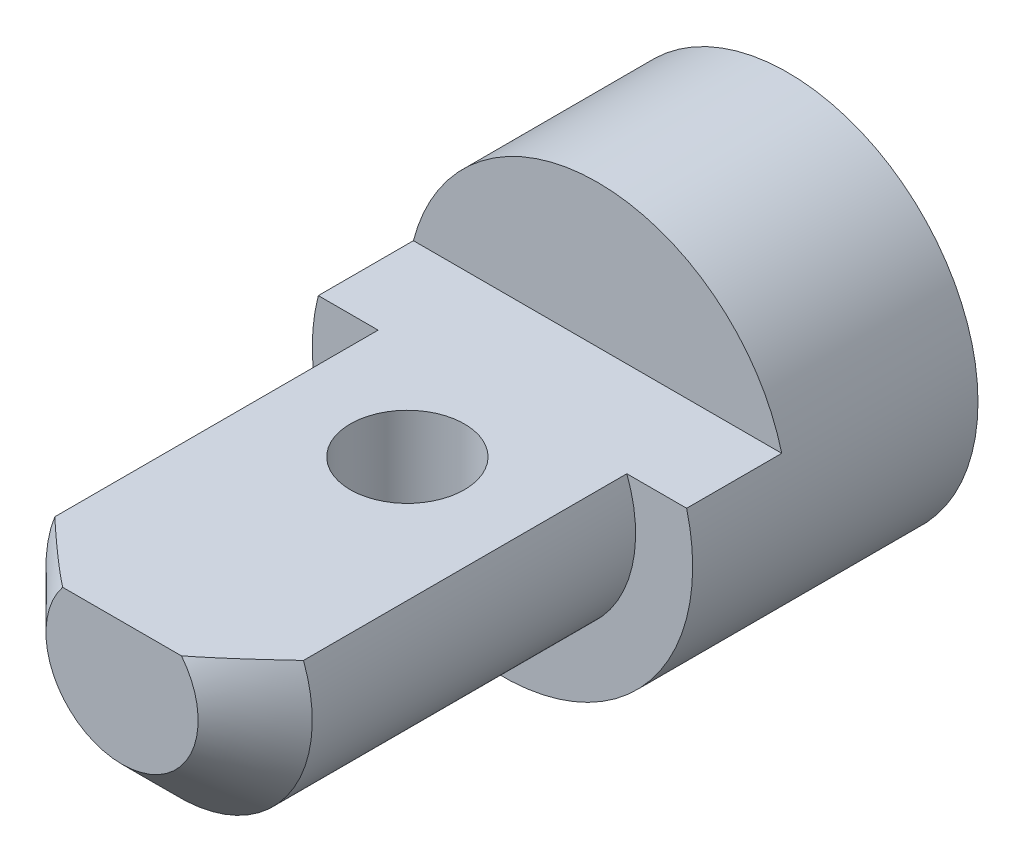
ISO-10303-21;
HEADER;
FILE_DESCRIPTION(('STEP AP214'),'2;1');
FILE_NAME('part.step','',(''),(''),'','','');
FILE_SCHEMA(('AUTOMOTIVE_DESIGN { 1 0 10303 214 1 1 1 1 }'));
ENDSEC;
DATA;
#1=APPLICATION_CONTEXT('core data for automotive mechanical design processes');
#2=APPLICATION_PROTOCOL_DEFINITION('international standard','automotive_design',2000,#1);
#3=PRODUCT_CONTEXT('',#1,'mechanical');
#4=PRODUCT('Part','Part','',(#3));
#5=PRODUCT_RELATED_PRODUCT_CATEGORY('part','',(#4));
#6=PRODUCT_DEFINITION_FORMATION('','',#4);
#7=PRODUCT_DEFINITION_CONTEXT('part definition',#1,'design');
#8=PRODUCT_DEFINITION('design','',#6,#7);
#9=PRODUCT_DEFINITION_SHAPE('','',#8);
#10=(LENGTH_UNIT() NAMED_UNIT(*) SI_UNIT(.MILLI.,.METRE.));
#11=(NAMED_UNIT(*) PLANE_ANGLE_UNIT() SI_UNIT($,.RADIAN.));
#12=(NAMED_UNIT(*) SI_UNIT($,.STERADIAN.) SOLID_ANGLE_UNIT());
#13=UNCERTAINTY_MEASURE_WITH_UNIT(LENGTH_MEASURE(1.E-05),#10,'distance_accuracy_value','');
#14=(GEOMETRIC_REPRESENTATION_CONTEXT(3) GLOBAL_UNCERTAINTY_ASSIGNED_CONTEXT((#13)) GLOBAL_UNIT_ASSIGNED_CONTEXT((#10,
#11,#12)) REPRESENTATION_CONTEXT('',''));
#15=CARTESIAN_POINT('',(0.,0.,0.));
#16=DIRECTION('',(0.,0.,1.));
#17=DIRECTION('',(1.,0.,0.));
#18=AXIS2_PLACEMENT_3D('',#15,#16,#17);
#19=CARTESIAN_POINT('',(0.,0.,0.));
#20=DIRECTION('',(0.,0.,1.));
#21=DIRECTION('',(1.,0.,0.));
#22=AXIS2_PLACEMENT_3D('',#19,#20,#21);
#23=PLANE('',#22);
#24=CARTESIAN_POINT('',(0.,0.,0.));
#25=DIRECTION('',(0.,0.,1.));
#26=DIRECTION('',(1.,0.,0.));
#27=AXIS2_PLACEMENT_3D('',#24,#25,#26);
#28=CIRCLE('',#27,20.);
#29=CARTESIAN_POINT('',(19.3649167310371,5.,0.));
#30=VERTEX_POINT('',#29);
#31=CARTESIAN_POINT('',(-19.3649167310371,5.,0.));
#32=VERTEX_POINT('',#31);
#33=EDGE_CURVE('E116',#30,#32,#28,.T.);
#34=ORIENTED_EDGE('',*,*,#33,.T.);
#35=DIRECTION('',(1.,0.,0.));
#36=VECTOR('',#35,1.);
#37=CARTESIAN_POINT('',(0.,5.,0.));
#38=LINE('',#37,#36);
#39=EDGE_CURVE('E105',#32,#30,#38,.T.);
#40=ORIENTED_EDGE('',*,*,#39,.T.);
#41=EDGE_LOOP('',(#34,#40));
#42=FACE_BOUND('',#41,.T.);
#43=ADVANCED_FACE('F35',(#42),#23,.T.);
#44=CARTESIAN_POINT('',(0.,0.,-20.));
#45=DIRECTION('',(0.,0.,1.));
#46=DIRECTION('',(1.,0.,0.));
#47=AXIS2_PLACEMENT_3D('',#44,#45,#46);
#48=CYLINDRICAL_SURFACE('',#47,20.);
#49=CARTESIAN_POINT('',(0.,0.,-20.));
#50=DIRECTION('',(0.,0.,1.));
#51=DIRECTION('',(1.,0.,0.));
#52=AXIS2_PLACEMENT_3D('',#49,#50,#51);
#53=CIRCLE('',#52,20.);
#54=CARTESIAN_POINT('',(20.,0.,-20.));
#55=VERTEX_POINT('',#54);
#56=EDGE_CURVE('E117',#55,#55,#53,.T.);
#57=ORIENTED_EDGE('',*,*,#56,.T.);
#58=EDGE_LOOP('',(#57));
#59=FACE_BOUND('',#58,.T.);
#60=ORIENTED_EDGE('',*,*,#33,.F.);
#61=DIRECTION('',(0.,0.,-1.));
#62=VECTOR('',#61,1.);
#63=CARTESIAN_POINT('',(19.3649167310371,5.,10.));
#64=LINE('',#63,#62);
#65=CARTESIAN_POINT('',(19.3649167310371,5.,10.));
#66=VERTEX_POINT('',#65);
#67=EDGE_CURVE('E101',#66,#30,#64,.T.);
#68=ORIENTED_EDGE('',*,*,#67,.F.);
#69=CARTESIAN_POINT('',(0.,0.,10.));
#70=DIRECTION('',(0.,0.,1.));
#71=DIRECTION('',(1.,0.,0.));
#72=AXIS2_PLACEMENT_3D('',#69,#70,#71);
#73=CIRCLE('',#72,20.);
#74=CARTESIAN_POINT('',(-19.3649167310371,5.,10.));
#75=VERTEX_POINT('',#74);
#76=EDGE_CURVE('E99',#75,#66,#73,.T.);
#77=ORIENTED_EDGE('',*,*,#76,.F.);
#78=DIRECTION('',(0.,0.,-1.));
#79=VECTOR('',#78,1.);
#80=CARTESIAN_POINT('',(-19.3649167310371,5.,10.));
#81=LINE('',#80,#79);
#82=EDGE_CURVE('E113',#75,#32,#81,.T.);
#83=ORIENTED_EDGE('',*,*,#82,.T.);
#84=EDGE_LOOP('',(#60,#68,#77,#83));
#85=FACE_BOUND('',#84,.T.);
#86=ADVANCED_FACE('F145',(#59,#85),#48,.T.);
#87=CARTESIAN_POINT('',(0.,0.,-20.));
#88=DIRECTION('',(0.,0.,1.));
#89=DIRECTION('',(1.,0.,0.));
#90=AXIS2_PLACEMENT_3D('',#87,#88,#89);
#91=PLANE('',#90);
#92=ORIENTED_EDGE('',*,*,#56,.F.);
#93=EDGE_LOOP('',(#92));
#94=FACE_BOUND('',#93,.T.);
#95=ADVANCED_FACE('F140',(#94),#91,.F.);
#96=CARTESIAN_POINT('',(0.,5.,10.));
#97=DIRECTION('',(0.,1.,0.));
#98=DIRECTION('',(0.,0.,1.));
#99=AXIS2_PLACEMENT_3D('',#96,#97,#98);
#100=PLANE('',#99);
#101=CARTESIAN_POINT('',(0.,5.,20.));
#102=DIRECTION('',(0.,1.,0.));
#103=DIRECTION('',(0.,0.,1.));
#104=AXIS2_PLACEMENT_3D('',#101,#102,#103);
#105=CIRCLE('',#104,6.);
#106=CARTESIAN_POINT('',(0.,5.,26.));
#107=VERTEX_POINT('',#106);
#108=EDGE_CURVE('E164',#107,#107,#105,.T.);
#109=ORIENTED_EDGE('',*,*,#108,.F.);
#110=EDGE_LOOP('',(#109));
#111=FACE_BOUND('',#110,.T.);
#112=DIRECTION('',(1.,0.,0.));
#113=VECTOR('',#112,1.);
#114=CARTESIAN_POINT('',(0.,5.,50.));
#115=LINE('',#114,#113);
#116=CARTESIAN_POINT('',(-6.24499799839841,5.,50.));
#117=VERTEX_POINT('',#116);
#118=CARTESIAN_POINT('',(6.24499799839841,5.,50.));
#119=VERTEX_POINT('',#118);
#120=EDGE_CURVE('E90',#117,#119,#115,.T.);
#121=ORIENTED_EDGE('',*,*,#120,.T.);
#122=CARTESIAN_POINT('',(6.24499799839841,5.,50.));
#123=CARTESIAN_POINT('',(6.39443122448454,5.,49.8833329823802));
#124=CARTESIAN_POINT('',(6.54308298546125,5.,49.7656720286842));
#125=CARTESIAN_POINT('',(6.83900305782603,5.,49.5286335268259));
#126=CARTESIAN_POINT('',(6.98627142153504,5.,49.4092560440194));
#127=CARTESIAN_POINT('',(7.27959406918002,5.,49.1690644102696));
#128=CARTESIAN_POINT('',(7.42564852737438,5.,49.0482504718027));
#129=CARTESIAN_POINT('',(7.71671327943721,5.,48.8053691428922));
#130=CARTESIAN_POINT('',(7.86172356180913,5.,48.6833017386834));
#131=CARTESIAN_POINT('',(8.29526067818571,5.,48.3155872050473));
#132=CARTESIAN_POINT('',(8.58241830801299,5.,48.0683252862952));
#133=CARTESIAN_POINT('',(9.15388909912427,5.,47.5705205120621));
#134=CARTESIAN_POINT('',(9.4382021352831,5.,47.3199775133658));
#135=CARTESIAN_POINT('',(10.0044556376435,5.,46.8164239431659));
#136=CARTESIAN_POINT('',(10.2863968925452,5.,46.5634142576553));
#137=CARTESIAN_POINT('',(10.8484442680545,5.,46.05536441232));
#138=CARTESIAN_POINT('',(11.1285503803207,5.,45.8003242432773));
#139=CARTESIAN_POINT('',(11.6873751197916,5.,45.2885044394326));
#140=CARTESIAN_POINT('',(11.9660931421804,5.,45.0317241448872));
#141=CARTESIAN_POINT('',(12.5222743698344,5.,44.5168081566791));
#142=CARTESIAN_POINT('',(12.799737576059,5.,44.258672464053));
#143=CARTESIAN_POINT('',(13.076696830622,5.,44.));
#144=B_SPLINE_CURVE_WITH_KNOTS('',3,(#122,#123,#124,#125,#126,#127,#128,#129,#130,#131,#132,
#133,#134,#135,#136,#137,#138,#139,#140,#141,#142,#143),.UNSPECIFIED.,.F.,.F.,(4,2,2,2,2,2,2,2,
2,2,4),(0.,0.568736687157001,1.13745177703299,1.70608376559099,2.27472200533744,
3.41151474217863,4.54835726520981,5.68480548564971,6.82125886818381,7.95817035954114,
9.09508098142301),.UNSPECIFIED.);
#145=CARTESIAN_POINT('',(13.076696830622,5.,44.));
#146=VERTEX_POINT('',#145);
#147=EDGE_CURVE('E50',#119,#146,#144,.T.);
#148=ORIENTED_EDGE('',*,*,#147,.T.);
#149=DIRECTION('',(0.,0.,-1.));
#150=VECTOR('',#149,1.);
#151=CARTESIAN_POINT('',(13.076696830622,5.,50.));
#152=LINE('',#151,#150);
#153=CARTESIAN_POINT('',(13.076696830622,5.,10.));
#154=VERTEX_POINT('',#153);
#155=EDGE_CURVE('E84',#146,#154,#152,.T.);
#156=ORIENTED_EDGE('',*,*,#155,.T.);
#157=DIRECTION('',(1.,0.,0.));
#158=VECTOR('',#157,1.);
#159=CARTESIAN_POINT('',(0.,5.,10.));
#160=LINE('',#159,#158);
#161=EDGE_CURVE('E87',#154,#66,#160,.T.);
#162=ORIENTED_EDGE('',*,*,#161,.T.);
#163=ORIENTED_EDGE('',*,*,#67,.T.);
#164=ORIENTED_EDGE('',*,*,#39,.F.);
#165=ORIENTED_EDGE('',*,*,#82,.F.);
#166=CARTESIAN_POINT('',(-13.076696830622,5.,10.));
#167=VERTEX_POINT('',#166);
#168=EDGE_CURVE('E103',#75,#167,#160,.T.);
#169=ORIENTED_EDGE('',*,*,#168,.T.);
#170=DIRECTION('',(0.,0.,-1.));
#171=VECTOR('',#170,1.);
#172=CARTESIAN_POINT('',(-13.076696830622,5.,50.));
#173=LINE('',#172,#171);
#174=CARTESIAN_POINT('',(-13.076696830622,5.,44.));
#175=VERTEX_POINT('',#174);
#176=EDGE_CURVE('E89',#175,#167,#173,.T.);
#177=ORIENTED_EDGE('',*,*,#176,.F.);
#178=CARTESIAN_POINT('',(-13.076696830622,5.,44.));
#179=CARTESIAN_POINT('',(-12.799737576059,5.,44.258672464053));
#180=CARTESIAN_POINT('',(-12.5222743698344,5.,44.5168081566791));
#181=CARTESIAN_POINT('',(-11.9660931421804,5.,45.0317241448872));
#182=CARTESIAN_POINT('',(-11.6873751197916,5.,45.2885044394326));
#183=CARTESIAN_POINT('',(-11.1285503803207,5.,45.8003242432773));
#184=CARTESIAN_POINT('',(-10.8484442680545,5.,46.0553644123199));
#185=CARTESIAN_POINT('',(-10.2863968925452,5.,46.5634142576553));
#186=CARTESIAN_POINT('',(-10.0044556376435,5.,46.8164239431659));
#187=CARTESIAN_POINT('',(-9.4382021352831,5.,47.3199775133658));
#188=CARTESIAN_POINT('',(-9.15388909912427,5.,47.5705205120621));
#189=CARTESIAN_POINT('',(-8.58241830801299,5.,48.0683252862952));
#190=CARTESIAN_POINT('',(-8.29526067818571,5.,48.3155872050473));
#191=CARTESIAN_POINT('',(-7.86172356180913,5.,48.6833017386834));
#192=CARTESIAN_POINT('',(-7.71671327943721,5.,48.8053691428922));
#193=CARTESIAN_POINT('',(-7.42564852737438,5.,49.0482504718027));
#194=CARTESIAN_POINT('',(-7.27959406918002,5.,49.1690644102696));
#195=CARTESIAN_POINT('',(-6.98627142153504,5.,49.4092560440194));
#196=CARTESIAN_POINT('',(-6.83900305782603,5.,49.5286335268259));
#197=CARTESIAN_POINT('',(-6.54308298546125,5.,49.7656720286842));
#198=CARTESIAN_POINT('',(-6.39443122448454,5.,49.8833329823802));
#199=CARTESIAN_POINT('',(-6.24499799839841,5.,50.));
#200=B_SPLINE_CURVE_WITH_KNOTS('',3,(#178,#179,#180,#181,#182,#183,#184,#185,#186,#187,#188,
#189,#190,#191,#192,#193,#194,#195,#196,#197,#198,#199),.UNSPECIFIED.,.F.,.F.,(4,2,2,2,2,2,2,2,
2,2,4),(0.,1.13691062188187,2.2738221132392,3.41027549577331,4.5467237162132,5.68356623924438,
6.82035897608557,7.38899721583202,7.95762920439002,8.52634429426601,9.09508098142301),.UNSPECIFIED.);
#201=EDGE_CURVE('E125',#175,#117,#200,.T.);
#202=ORIENTED_EDGE('',*,*,#201,.T.);
#203=EDGE_LOOP('',(#121,#148,#156,#162,#163,#164,#165,#169,#177,#202));
#204=FACE_BOUND('',#203,.T.);
#205=ADVANCED_FACE('F86',(#111,#204),#100,.T.);
#206=CARTESIAN_POINT('',(0.,0.,10.));
#207=DIRECTION('',(0.,0.,1.));
#208=DIRECTION('',(1.,0.,0.));
#209=AXIS2_PLACEMENT_3D('',#206,#207,#208);
#210=PLANE('',#209);
#211=CARTESIAN_POINT('',(0.,0.,10.));
#212=DIRECTION('',(0.,0.,1.));
#213=DIRECTION('',(1.,0.,0.));
#214=AXIS2_PLACEMENT_3D('',#211,#212,#213);
#215=CIRCLE('',#214,14.);
#216=EDGE_CURVE('E96',#167,#154,#215,.T.);
#217=ORIENTED_EDGE('',*,*,#216,.F.);
#218=ORIENTED_EDGE('',*,*,#168,.F.);
#219=ORIENTED_EDGE('',*,*,#76,.T.);
#220=ORIENTED_EDGE('',*,*,#161,.F.);
#221=EDGE_LOOP('',(#217,#218,#219,#220));
#222=FACE_BOUND('',#221,.T.);
#223=ADVANCED_FACE('F94',(#222),#210,.T.);
#224=CARTESIAN_POINT('',(0.,0.,50.));
#225=DIRECTION('',(0.,0.,-1.));
#226=DIRECTION('',(-1.,0.,0.));
#227=AXIS2_PLACEMENT_3D('',#224,#225,#226);
#228=CYLINDRICAL_SURFACE('',#227,14.);
#229=CARTESIAN_POINT('',(0.,-14.,26.));
#230=CARTESIAN_POINT('',(0.160363681383133,-13.9999990537504,25.9999988410743));
#231=CARTESIAN_POINT('',(0.320775956533767,-13.9972372383083,25.9935622885338));
#232=CARTESIAN_POINT('',(0.640453117164361,-13.986258588627,25.9678773694425));
#233=CARTESIAN_POINT('',(0.799717246970883,-13.9780384437859,25.9486212274985));
#234=CARTESIAN_POINT('',(1.11616337880896,-13.9563382553018,25.8974499152499));
#235=CARTESIAN_POINT('',(1.27334062770108,-13.9428478174418,25.8655097270518));
#236=CARTESIAN_POINT('',(1.58422523380988,-13.9109547480173,25.7892883129979));
#237=CARTESIAN_POINT('',(1.73793114488505,-13.8925501087192,25.7450020427317));
#238=CARTESIAN_POINT('',(2.0401899627658,-13.8513825836492,25.6447214517889));
#239=CARTESIAN_POINT('',(2.18876065996995,-13.8286370109042,25.5887735623076));
#240=CARTESIAN_POINT('',(2.48051708240799,-13.7792938310225,25.4655398660106));
#241=CARTESIAN_POINT('',(2.62370076796664,-13.7526947829776,25.3982498165397));
#242=CARTESIAN_POINT('',(2.9037238553757,-13.6963047809831,25.2529274449012));
#243=CARTESIAN_POINT('',(3.0405676490064,-13.6665160854092,25.1749027122374));
#244=CARTESIAN_POINT('',(3.30731934915064,-13.6044268884813,25.0086296158907));
#245=CARTESIAN_POINT('',(3.43722471085737,-13.5721254760646,24.9203775382358));
#246=CARTESIAN_POINT('',(3.82752784058117,-13.4693897159664,24.6322504070197));
#247=CARTESIAN_POINT('',(4.07521497627433,-13.3958961415463,24.4158798548643));
#248=CARTESIAN_POINT('',(4.53204677472635,-13.2483348543954,23.9456418494092));
#249=CARTESIAN_POINT('',(4.74117003881358,-13.1742668465276,23.6917537179111));
#250=CARTESIAN_POINT('',(5.02713605121142,-13.0667148877462,23.2799210707966));
#251=CARTESIAN_POINT('',(5.11975945697528,-13.030606328491,23.1333997560552));
#252=CARTESIAN_POINT('',(5.29224079890097,-12.9615126824508,22.8323567506314));
#253=CARTESIAN_POINT('',(5.37210403950068,-12.9285263001043,22.6778384198833));
#254=CARTESIAN_POINT('',(5.51837793197798,-12.8667717686962,22.3617451373417));
#255=CARTESIAN_POINT('',(5.58478822392122,-12.8380037325024,22.2001699968834));
#256=CARTESIAN_POINT('',(5.70344919527723,-12.7857293283208,21.8711560752487));
#257=CARTESIAN_POINT('',(5.75570729453786,-12.7622202042692,21.703720418883));
#258=CARTESIAN_POINT('',(5.84326130068753,-12.7223620629992,21.3726416134423));
#259=CARTESIAN_POINT('',(5.87927061257001,-12.7057154769023,21.2092229754819));
#260=CARTESIAN_POINT('',(5.93754620580924,-12.6785875525189,20.8795183420371));
#261=CARTESIAN_POINT('',(5.95981894919582,-12.6681033154166,20.7132337326812));
#262=CARTESIAN_POINT('',(5.99035686967457,-12.6536916031343,20.3791480230451));
#263=CARTESIAN_POINT('',(5.99862617619652,-12.6497621950263,20.2113473845009));
#264=CARTESIAN_POINT('',(6.00105864102556,-12.6486085884131,19.8756255297031));
#265=CARTESIAN_POINT('',(5.99522260830682,-12.6513840053704,19.7077043209166));
#266=CARTESIAN_POINT('',(5.97058551740811,-12.663027676971,19.386964114795));
#267=CARTESIAN_POINT('',(5.95289101226726,-12.6713756912862,19.234039586574));
#268=CARTESIAN_POINT('',(5.90587935659455,-12.6933550454174,18.930322829231));
#269=CARTESIAN_POINT('',(5.87655842453047,-12.7069881041786,18.7795313104202));
#270=CARTESIAN_POINT('',(5.80660124827526,-12.7391074717928,18.4811658475693));
#271=CARTESIAN_POINT('',(5.76596746505921,-12.7575927250591,18.3335912112555));
#272=CARTESIAN_POINT('',(5.673747433178,-12.7988726614125,18.0424712816898));
#273=CARTESIAN_POINT('',(5.62215695127544,-12.8216690097632,17.8989275701686));
#274=CARTESIAN_POINT('',(5.50723693195211,-12.8714544531689,17.6136899020706));
#275=CARTESIAN_POINT('',(5.4436796531841,-12.8985228844704,17.4721013950009));
#276=CARTESIAN_POINT('',(5.30609098558134,-12.9557307543852,17.1947540128631));
#277=CARTESIAN_POINT('',(5.23205606663476,-12.9858712270648,17.0589971227525));
#278=CARTESIAN_POINT('',(4.9948974601696,-13.0797494826667,16.6614297055487));
#279=CARTESIAN_POINT('',(4.81665685211529,-13.1469726409183,16.4091668313098));
#280=CARTESIAN_POINT('',(4.51369305075851,-13.252902951098,16.043388578561));
#281=CARTESIAN_POINT('',(4.40146708910814,-13.2906838157786,15.9189238785212));
#282=CARTESIAN_POINT('',(4.16697101438719,-13.3660577044861,15.6797745263382));
#283=CARTESIAN_POINT('',(4.04470376303658,-13.4036507788146,15.5650871065761));
#284=CARTESIAN_POINT('',(3.79072333409162,-13.4776825629112,15.3461240722947));
#285=CARTESIAN_POINT('',(3.65900421311577,-13.5141205252085,15.241855109289));
#286=CARTESIAN_POINT('',(3.38695651941585,-13.5848543144894,15.0445236625119));
#287=CARTESIAN_POINT('',(3.24663141809501,-13.6191509940844,14.9514567044752));
#288=CARTESIAN_POINT('',(2.95433488032786,-13.6855744535274,14.7748858921479));
#289=CARTESIAN_POINT('',(2.80215446243704,-13.7176206799856,14.6916970562264));
#290=CARTESIAN_POINT('',(2.49056113820211,-13.7776000243361,14.5385693547671));
#291=CARTESIAN_POINT('',(2.3311512186302,-13.8055348209221,14.4686250781244));
#292=CARTESIAN_POINT('',(2.00620118567456,-13.8564856073538,14.3426585463485));
#293=CARTESIAN_POINT('',(1.84066264328836,-13.8795028476516,14.286632751388));
#294=CARTESIAN_POINT('',(1.50469500305639,-13.9199320786169,14.1891066554481));
#295=CARTESIAN_POINT('',(1.33426630249486,-13.9373445232307,14.1476051780848));
#296=CARTESIAN_POINT('',(1.00132514949257,-13.9650772745411,14.0818745804649));
#297=CARTESIAN_POINT('',(0.839034610253474,-13.975790469307,14.0566846521055));
#298=CARTESIAN_POINT('',(0.512665804736752,-13.991563820811,14.0196872931189));
#299=CARTESIAN_POINT('',(0.348587644185688,-13.9966243100581,14.0078790753393));
#300=CARTESIAN_POINT('',(0.0199826904089019,-14.0009497975368,13.9977824306154));
#301=CARTESIAN_POINT('',(-0.144543975906237,-14.0002162932927,13.9994905102284));
#302=CARTESIAN_POINT('',(-0.47277205725828,-13.9929778959263,14.0163983039018));
#303=CARTESIAN_POINT('',(-0.636473492547907,-13.9864731451415,14.0315976852231));
#304=CARTESIAN_POINT('',(-0.953064075268889,-13.9683733961229,14.074141232916));
#305=CARTESIAN_POINT('',(-1.10606359992914,-13.9570689343218,14.1007931247162));
#306=CARTESIAN_POINT('',(-1.4091829061583,-13.9297296452217,14.1657702510079));
#307=CARTESIAN_POINT('',(-1.55930173647897,-13.913693283062,14.2040992732779));
#308=CARTESIAN_POINT('',(-1.85559929614725,-13.8772845865002,14.2920556764727));
#309=CARTESIAN_POINT('',(-2.00177913626958,-13.8569134891971,14.3416798341365));
#310=CARTESIAN_POINT('',(-2.28942355781484,-13.8123036924292,14.4518229681137));
#311=CARTESIAN_POINT('',(-2.43088631718923,-13.7880635189212,14.5123460978561));
#312=CARTESIAN_POINT('',(-2.71253646751843,-13.7354758796638,14.6458263588327));
#313=CARTESIAN_POINT('',(-2.85254997910771,-13.7070247997303,14.7191093916386));
#314=CARTESIAN_POINT('',(-3.12595765509681,-13.6472700453768,14.8762067365519));
#315=CARTESIAN_POINT('',(-3.25934953632981,-13.6159653974428,14.9600246464265));
#316=CARTESIAN_POINT('',(-3.51881267602843,-13.5512302072993,15.1376262875817));
#317=CARTESIAN_POINT('',(-3.6448825859396,-13.5177992758334,15.2314118457504));
#318=CARTESIAN_POINT('',(-3.88906955731437,-13.4495803726257,15.4283758920217));
#319=CARTESIAN_POINT('',(-4.00718620340059,-13.4147923301553,15.5315548700562));
#320=CARTESIAN_POINT('',(-4.24351546036308,-13.3420012580829,15.7548889017171));
#321=CARTESIAN_POINT('',(-4.36105986219512,-13.3039540459527,15.875737671399));
#322=CARTESIAN_POINT('',(-4.58558671709637,-13.2282436576858,16.1269180827378));
#323=CARTESIAN_POINT('',(-4.69257231997918,-13.1905803700445,16.2572468761179));
#324=CARTESIAN_POINT('',(-4.89544082988654,-13.1166430471773,16.5267983116787));
#325=CARTESIAN_POINT('',(-4.99131618844497,-13.0803699675486,16.6660269020127));
#326=CARTESIAN_POINT('',(-5.17118620045885,-13.0103093106072,16.9524728667542));
#327=CARTESIAN_POINT('',(-5.25518580668279,-12.976520699988,17.0996868751982));
#328=CARTESIAN_POINT('',(-5.41213466133456,-12.9118604125277,17.4041068174776));
#329=CARTESIAN_POINT('',(-5.48485061225773,-12.8810542975559,17.5614472554916));
#330=CARTESIAN_POINT('',(-5.61660931119991,-12.8241511591201,17.8825031863331));
#331=CARTESIAN_POINT('',(-5.67565804210804,-12.79805207624,18.0462158528847));
#332=CARTESIAN_POINT('',(-5.77945378828479,-12.751515688178,18.3788138026724));
#333=CARTESIAN_POINT('',(-5.82420814768183,-12.7310754763162,18.5476963806884));
#334=CARTESIAN_POINT('',(-5.89889998779933,-12.6966404189285,18.889349143402));
#335=CARTESIAN_POINT('',(-5.92883897856873,-12.6826449165389,19.0621189300204));
#336=CARTESIAN_POINT('',(-5.97170241129245,-12.6625147671109,19.3960273596127));
#337=CARTESIAN_POINT('',(-5.98580201954785,-12.6558382421549,19.5569833718664));
#338=CARTESIAN_POINT('',(-6.00096609124747,-12.6486552378245,19.8796426329213));
#339=CARTESIAN_POINT('',(-6.00203128016557,-12.6481484150548,20.0413458396337));
#340=CARTESIAN_POINT('',(-5.99111450341246,-12.6533229693185,20.3641837082095));
#341=CARTESIAN_POINT('',(-5.97913459270392,-12.6590033716935,20.5253184556099));
#342=CARTESIAN_POINT('',(-5.94227908855827,-12.6763453696482,20.8457744807606));
#343=CARTESIAN_POINT('',(-5.91740363674358,-12.6880068995416,21.0050957784072));
#344=CARTESIAN_POINT('',(-5.85667778129198,-12.7161465092493,21.3124629131907));
#345=CARTESIAN_POINT('',(-5.82147048517053,-12.7323403074572,21.4606622389043));
#346=CARTESIAN_POINT('',(-5.74008017957707,-12.7692389813361,21.7534544744015));
#347=CARTESIAN_POINT('',(-5.6938936376196,-12.7899453086988,21.898046206892));
#348=CARTESIAN_POINT('',(-5.53944441771267,-12.8579660748967,22.3250861942369));
#349=CARTESIAN_POINT('',(-5.41524998989461,-12.9112029008273,22.6010099659789));
#350=CARTESIAN_POINT('',(-5.11926125400695,-13.031506185693,23.1456798805543));
#351=CARTESIAN_POINT('',(-4.94499423195833,-13.0992251981205,23.4129217411006));
#352=CARTESIAN_POINT('',(-4.55696241926012,-13.2392033749025,23.915981295058));
#353=CARTESIAN_POINT('',(-4.34318269508334,-13.3114642489822,24.1517870492368));
#354=CARTESIAN_POINT('',(-3.98734479751963,-13.4208115521021,24.4867030338455));
#355=CARTESIAN_POINT('',(-3.8575264923125,-13.4587888290458,24.5987992814844));
#356=CARTESIAN_POINT('',(-3.58847846710229,-13.5330064088879,24.8116741481119));
#357=CARTESIAN_POINT('',(-3.44925213049637,-13.5692473283012,24.9124568014565));
#358=CARTESIAN_POINT('',(-3.16205411319822,-13.6390350474462,25.1020641453525));
#359=CARTESIAN_POINT('',(-3.01407442420752,-13.6725793117516,25.1908776342069));
#360=CARTESIAN_POINT('',(-2.71046030805951,-13.7359905544834,25.3556716645832));
#361=CARTESIAN_POINT('',(-2.55482945602919,-13.7658592279565,25.4316581275114));
#362=CARTESIAN_POINT('',(-2.23913102250328,-13.820694527533,25.5691576994033));
#363=CARTESIAN_POINT('',(-2.07915653516537,-13.8457241479383,25.63085920975));
#364=CARTESIAN_POINT('',(-1.75393065279769,-13.8906678781383,25.7404838341442));
#365=CARTESIAN_POINT('',(-1.588681818965,-13.9105844295694,25.7884135259372));
#366=CARTESIAN_POINT('',(-1.25453418378902,-13.9446865780714,25.8698935087665));
#367=CARTESIAN_POINT('',(-1.0856453487636,-13.9588861368303,25.9034788430724));
#368=CARTESIAN_POINT('',(-0.745294439169052,-13.9811865105588,25.9560177538751));
#369=CARTESIAN_POINT('',(-0.5738343007416,-13.9892917003214,25.9749818263739));
#370=CARTESIAN_POINT('',(-0.334986292107451,-13.9961520498919,25.991016791565));
#371=CARTESIAN_POINT('',(-0.268044715112434,-13.9975941097601,25.9943844286929));
#372=CARTESIAN_POINT('',(-0.134071589958207,-13.9995182855783,25.998876282106));
#373=CARTESIAN_POINT('',(-0.0670400412440279,-14.0000003955797,26.0000004844889));
#374=CARTESIAN_POINT('',(0.,-14.,26.));
#375=B_SPLINE_CURVE_WITH_KNOTS('',3,(#229,#230,#231,#232,#233,#234,#235,#236,#237,#238,#239,
#240,#241,#242,#243,#244,#245,#246,#247,#248,#249,#250,#251,#252,#253,#254,#255,#256,#257,#258,
#259,#260,#261,#262,#263,#264,#265,#266,#267,#268,#269,#270,#271,#272,#273,#274,#275,#276,#277,
#278,#279,#280,#281,#282,#283,#284,#285,#286,#287,#288,#289,#290,#291,#292,#293,#294,#295,#296,
#297,#298,#299,#300,#301,#302,#303,#304,#305,#306,#307,#308,#309,#310,#311,#312,#313,#314,#315,
#316,#317,#318,#319,#320,#321,#322,#323,#324,#325,#326,#327,#328,#329,#330,#331,#332,#333,#334,
#335,#336,#337,#338,#339,#340,#341,#342,#343,#344,#345,#346,#347,#348,#349,#350,#351,#352,#353,
#354,#355,#356,#357,#358,#359,#360,#361,#362,#363,#364,#365,#366,#367,#368,#369,#370,#371,#372,
#373,#374),.UNSPECIFIED.,.T.,.F.,(4,2,2,2,2,2,2,2,2,2,2,2,2,2,2,2,2,2,2,2,2,2,2,2,2,2,2,2,2,2,2,
2,2,2,2,2,2,2,2,2,2,2,2,2,2,2,2,2,2,2,2,2,2,2,2,2,2,2,2,2,2,2,2,2,2,2,2,2,2,2,2,2,4),(0.,
0.48102324014907,0.962338498737823,1.44460785207364,1.92707454243652,2.40765576202322,
2.88841714867876,3.36884036352093,3.84943858984734,4.85579224178684,5.86270263905159,
6.39332771031806,6.92373162203539,7.45414972286331,7.98428919021919,8.48810476718191,
8.99168315539303,9.49511301907022,9.99851401055312,10.4604850172352,10.9226064048651,
11.3846273419732,11.8468271115992,12.3189253249946,12.7911829774079,13.7351925978072,
14.2501351453187,14.764931442562,15.2800543317843,15.7949707848419,16.3233987321237,
16.8516103205541,17.3796874333688,17.9077217651564,18.4008335823044,18.893916391623,
19.3868717621764,19.8798149751963,20.3464206603165,20.813177862469,21.2798020340552,
21.7466044066358,22.2278030101686,22.7091663967022,23.1906181610052,23.672095050755,
24.1899820227039,24.7077140329398,25.2257957609064,25.7436607820765,26.2711105861375,
26.7983290580512,27.3252762195467,27.8521696611514,28.3366694685894,28.8211423094589,
29.3055388435439,29.7899300579646,30.2489492298206,30.7081162878295,31.6258101478047,
32.6003703873741,33.5752997105948,34.1017928187658,34.6280975824074,35.1548915332133,
35.6814416283858,36.2005915319234,36.7194930634754,37.2371195649487,37.7543741367973,
37.9554646689303,38.1565564471982),.UNSPECIFIED.);
#376=CARTESIAN_POINT('',(0.,-14.,26.));
#377=VERTEX_POINT('',#376);
#378=EDGE_CURVE('E40',#377,#377,#375,.T.);
#379=ORIENTED_EDGE('',*,*,#378,.T.);
#380=EDGE_LOOP('',(#379));
#381=FACE_BOUND('',#380,.T.);
#382=ORIENTED_EDGE('',*,*,#155,.F.);
#383=CARTESIAN_POINT('',(0.,0.,44.));
#384=DIRECTION('',(0.,0.,1.));
#385=DIRECTION('',(1.,0.,0.));
#386=AXIS2_PLACEMENT_3D('',#383,#384,#385);
#387=CIRCLE('',#386,14.);
#388=EDGE_CURVE('E11',#146,#175,#387,.F.);
#389=ORIENTED_EDGE('',*,*,#388,.T.);
#390=ORIENTED_EDGE('',*,*,#176,.T.);
#391=ORIENTED_EDGE('',*,*,#216,.T.);
#392=EDGE_LOOP('',(#382,#389,#390,#391));
#393=FACE_BOUND('',#392,.T.);
#394=ADVANCED_FACE('F104',(#381,#393),#228,.T.);
#395=CARTESIAN_POINT('',(0.,0.,50.));
#396=DIRECTION('',(0.,0.,1.));
#397=DIRECTION('',(1.,0.,0.));
#398=AXIS2_PLACEMENT_3D('',#395,#396,#397);
#399=PLANE('',#398);
#400=ORIENTED_EDGE('',*,*,#120,.F.);
#401=CARTESIAN_POINT('',(0.,0.,50.));
#402=DIRECTION('',(0.,0.,1.));
#403=DIRECTION('',(1.,0.,0.));
#404=AXIS2_PLACEMENT_3D('',#401,#402,#403);
#405=CIRCLE('',#404,8.00000000000001);
#406=EDGE_CURVE('E120',#117,#119,#405,.T.);
#407=ORIENTED_EDGE('',*,*,#406,.T.);
#408=EDGE_LOOP('',(#400,#407));
#409=FACE_BOUND('',#408,.T.);
#410=ADVANCED_FACE('F161',(#409),#399,.T.);
#411=CARTESIAN_POINT('',(0.,0.,50.));
#412=DIRECTION('',(0.,0.,-1.));
#413=DIRECTION('',(-1.,0.,0.));
#414=AXIS2_PLACEMENT_3D('',#411,#412,#413);
#415=CONICAL_SURFACE('',#414,8.00000000000001,0.785398163397448);
#416=ORIENTED_EDGE('',*,*,#201,.F.);
#417=ORIENTED_EDGE('',*,*,#388,.F.);
#418=ORIENTED_EDGE('',*,*,#147,.F.);
#419=ORIENTED_EDGE('',*,*,#406,.F.);
#420=EDGE_LOOP('',(#416,#417,#418,#419));
#421=FACE_BOUND('',#420,.T.);
#422=ADVANCED_FACE('F37',(#421),#415,.T.);
#423=CARTESIAN_POINT('',(0.,-45.,20.));
#424=DIRECTION('',(0.,1.,0.));
#425=DIRECTION('',(0.,0.,1.));
#426=AXIS2_PLACEMENT_3D('',#423,#424,#425);
#427=CYLINDRICAL_SURFACE('',#426,6.);
#428=ORIENTED_EDGE('',*,*,#108,.T.);
#429=EDGE_LOOP('',(#428));
#430=FACE_BOUND('',#429,.T.);
#431=ORIENTED_EDGE('',*,*,#378,.F.);
#432=EDGE_LOOP('',(#431));
#433=FACE_BOUND('',#432,.T.);
#434=ADVANCED_FACE('F169',(#430,#433),#427,.F.);
#435=CLOSED_SHELL('',(#43,#86,#95,#205,#223,#394,#410,#422,#434));
#436=MANIFOLD_SOLID_BREP('B2',#435);
#437=ADVANCED_BREP_SHAPE_REPRESENTATION('',(#18,#436),#14);
#438=SHAPE_DEFINITION_REPRESENTATION(#9,#437);
ENDSEC;
END-ISO-10303-21;
